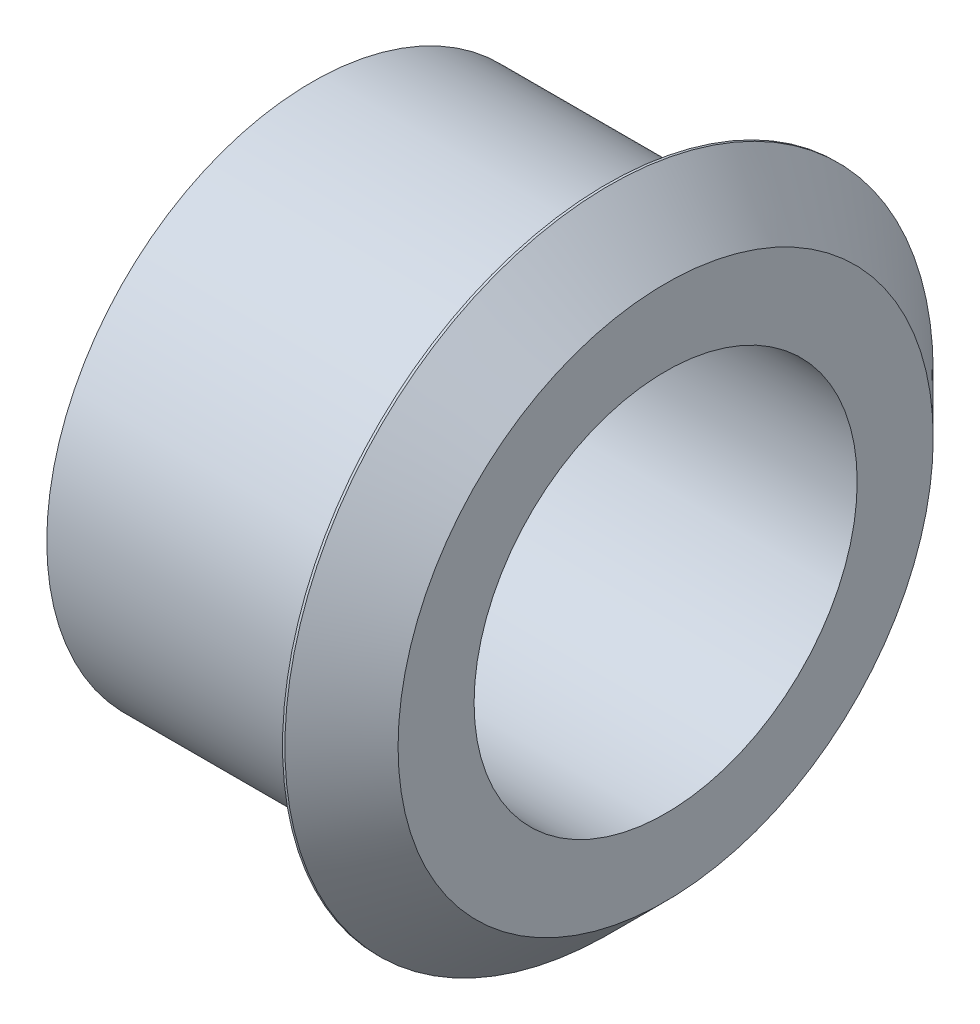
ISO-10303-21;
HEADER;
FILE_DESCRIPTION(('STEP AP214'),'2;1');
FILE_NAME('part.step','',(''),(''),'','','');
FILE_SCHEMA(('AUTOMOTIVE_DESIGN { 1 0 10303 214 1 1 1 1 }'));
ENDSEC;
DATA;
#1=APPLICATION_CONTEXT('core data for automotive mechanical design processes');
#2=APPLICATION_PROTOCOL_DEFINITION('international standard','automotive_design',2000,#1);
#3=PRODUCT_CONTEXT('',#1,'mechanical');
#4=PRODUCT('Part','Part','',(#3));
#5=PRODUCT_RELATED_PRODUCT_CATEGORY('part','',(#4));
#6=PRODUCT_DEFINITION_FORMATION('','',#4);
#7=PRODUCT_DEFINITION_CONTEXT('part definition',#1,'design');
#8=PRODUCT_DEFINITION('design','',#6,#7);
#9=PRODUCT_DEFINITION_SHAPE('','',#8);
#10=(LENGTH_UNIT() NAMED_UNIT(*) SI_UNIT(.MILLI.,.METRE.));
#11=(NAMED_UNIT(*) PLANE_ANGLE_UNIT() SI_UNIT($,.RADIAN.));
#12=(NAMED_UNIT(*) SI_UNIT($,.STERADIAN.) SOLID_ANGLE_UNIT());
#13=UNCERTAINTY_MEASURE_WITH_UNIT(LENGTH_MEASURE(1.E-05),#10,'distance_accuracy_value','');
#14=(GEOMETRIC_REPRESENTATION_CONTEXT(3) GLOBAL_UNCERTAINTY_ASSIGNED_CONTEXT((#13)) GLOBAL_UNIT_ASSIGNED_CONTEXT((#10,
#11,#12)) REPRESENTATION_CONTEXT('',''));
#15=CARTESIAN_POINT('',(0.,0.,0.));
#16=DIRECTION('',(0.,0.,1.));
#17=DIRECTION('',(1.,0.,0.));
#18=AXIS2_PLACEMENT_3D('',#15,#16,#17);
#19=CARTESIAN_POINT('',(3.60680000000002,0.,-225.73742));
#20=DIRECTION('',(1.,0.,0.));
#21=DIRECTION('',(0.,0.,-1.));
#22=AXIS2_PLACEMENT_3D('',#19,#20,#21);
#23=PLANE('',#22);
#24=CARTESIAN_POINT('',(3.60680000000002,0.,-225.73742));
#25=DIRECTION('',(1.,0.,0.));
#26=DIRECTION('',(0.,0.,-1.));
#27=AXIS2_PLACEMENT_3D('',#24,#25,#26);
#28=CIRCLE('',#27,17.4625);
#29=CARTESIAN_POINT('',(3.60680000000002,0.,-243.19992));
#30=VERTEX_POINT('',#29);
#31=EDGE_CURVE('E54',#30,#30,#28,.T.);
#32=ORIENTED_EDGE('',*,*,#31,.F.);
#33=EDGE_LOOP('',(#32));
#34=FACE_BOUND('',#33,.T.);
#35=CARTESIAN_POINT('',(3.60680000000002,0.,-225.73742));
#36=DIRECTION('',(1.,0.,0.));
#37=DIRECTION('',(0.,0.,-1.));
#38=AXIS2_PLACEMENT_3D('',#35,#36,#37);
#39=CIRCLE('',#38,14.2875);
#40=CARTESIAN_POINT('',(3.60680000000001,0.,-240.02492));
#41=VERTEX_POINT('',#40);
#42=EDGE_CURVE('E50',#41,#41,#39,.F.);
#43=ORIENTED_EDGE('',*,*,#42,.F.);
#44=EDGE_LOOP('',(#43));
#45=FACE_BOUND('',#44,.T.);
#46=ADVANCED_FACE('F38',(#34,#45),#23,.F.);
#47=CARTESIAN_POINT('',(6.78180000000001,0.,-225.73742));
#48=DIRECTION('',(1.,0.,0.));
#49=DIRECTION('',(0.,0.,-1.));
#50=AXIS2_PLACEMENT_3D('',#47,#48,#49);
#51=PLANE('',#50);
#52=CARTESIAN_POINT('',(6.78180000000001,0.,-225.73742));
#53=DIRECTION('',(1.,0.,0.));
#54=DIRECTION('',(0.,0.,-1.));
#55=AXIS2_PLACEMENT_3D('',#52,#53,#54);
#56=CIRCLE('',#55,14.4145);
#57=CARTESIAN_POINT('',(6.78180000000001,0.,-240.15192));
#58=VERTEX_POINT('',#57);
#59=EDGE_CURVE('E46',#58,#58,#56,.T.);
#60=ORIENTED_EDGE('',*,*,#59,.T.);
#61=EDGE_LOOP('',(#60));
#62=FACE_BOUND('',#61,.T.);
#63=CARTESIAN_POINT('',(6.78180000000001,0.,-225.73742));
#64=DIRECTION('',(1.,0.,0.));
#65=DIRECTION('',(0.,0.,-1.));
#66=AXIS2_PLACEMENT_3D('',#63,#64,#65);
#67=CIRCLE('',#66,10.31875);
#68=CARTESIAN_POINT('',(6.78180000000001,0.,-236.05617));
#69=VERTEX_POINT('',#68);
#70=EDGE_CURVE('E59',#69,#69,#67,.T.);
#71=ORIENTED_EDGE('',*,*,#70,.F.);
#72=EDGE_LOOP('',(#71));
#73=FACE_BOUND('',#72,.T.);
#74=ADVANCED_FACE('F85',(#62,#73),#51,.T.);
#75=CARTESIAN_POINT('',(6.78180000000001,0.,-225.73742));
#76=DIRECTION('',(-1.,0.,0.));
#77=DIRECTION('',(0.,0.,1.));
#78=AXIS2_PLACEMENT_3D('',#75,#76,#77);
#79=CYLINDRICAL_SURFACE('',#78,17.4625);
#80=CARTESIAN_POINT('',(3.73379999999999,0.,-225.73742));
#81=DIRECTION('',(1.,0.,0.));
#82=DIRECTION('',(0.,0.,-1.));
#83=AXIS2_PLACEMENT_3D('',#80,#81,#82);
#84=CIRCLE('',#83,17.4625);
#85=CARTESIAN_POINT('',(3.73379999999999,0.,-243.19992));
#86=VERTEX_POINT('',#85);
#87=EDGE_CURVE('E10',#86,#86,#84,.F.);
#88=ORIENTED_EDGE('',*,*,#87,.T.);
#89=EDGE_LOOP('',(#88));
#90=FACE_BOUND('',#89,.T.);
#91=ORIENTED_EDGE('',*,*,#31,.T.);
#92=EDGE_LOOP('',(#91));
#93=FACE_BOUND('',#92,.T.);
#94=ADVANCED_FACE('F91',(#90,#93),#79,.T.);
#95=CARTESIAN_POINT('',(6.78180000000001,0.,-225.73742));
#96=DIRECTION('',(-1.,0.,0.));
#97=DIRECTION('',(0.,0.,1.));
#98=AXIS2_PLACEMENT_3D('',#95,#96,#97);
#99=CYLINDRICAL_SURFACE('',#98,10.31875);
#100=ORIENTED_EDGE('',*,*,#70,.T.);
#101=EDGE_LOOP('',(#100));
#102=FACE_BOUND('',#101,.T.);
#103=CARTESIAN_POINT('',(-12.2682,0.,-225.73742));
#104=DIRECTION('',(1.,0.,0.));
#105=DIRECTION('',(0.,0.,-1.));
#106=AXIS2_PLACEMENT_3D('',#103,#104,#105);
#107=CIRCLE('',#106,10.31875);
#108=CARTESIAN_POINT('',(-12.2682,0.,-236.05617));
#109=VERTEX_POINT('',#108);
#110=EDGE_CURVE('E62',#109,#109,#107,.T.);
#111=ORIENTED_EDGE('',*,*,#110,.F.);
#112=EDGE_LOOP('',(#111));
#113=FACE_BOUND('',#112,.T.);
#114=ADVANCED_FACE('F81',(#102,#113),#99,.F.);
#115=CARTESIAN_POINT('',(-52.6793525448111,0.,-225.73742));
#116=DIRECTION('',(1.,0.,0.));
#117=DIRECTION('',(0.,0.,-1.));
#118=AXIS2_PLACEMENT_3D('',#115,#116,#117);
#119=CYLINDRICAL_SURFACE('',#118,14.2875);
#120=CARTESIAN_POINT('',(-12.2682,0.,-225.73742));
#121=DIRECTION('',(1.,0.,0.));
#122=DIRECTION('',(0.,0.,-1.));
#123=AXIS2_PLACEMENT_3D('',#120,#121,#122);
#124=CIRCLE('',#123,14.2875);
#125=CARTESIAN_POINT('',(-12.2682,0.,-240.02492));
#126=VERTEX_POINT('',#125);
#127=EDGE_CURVE('E65',#126,#126,#124,.T.);
#128=CARTESIAN_POINT('',(-12.2682,0.,-240.02492));
#129=CARTESIAN_POINT('',(-12.1028354166667,0.,-240.02492));
#130=CARTESIAN_POINT('',(-11.9374708333333,0.,-240.02492));
#131=CARTESIAN_POINT('',(-11.6067416666667,0.,-240.02492));
#132=CARTESIAN_POINT('',(-11.4413770833333,0.,-240.02492));
#133=CARTESIAN_POINT('',(-11.1106479166667,0.,-240.02492));
#134=CARTESIAN_POINT('',(-10.9452833333333,0.,-240.02492));
#135=CARTESIAN_POINT('',(-10.6145541666667,0.,-240.02492));
#136=CARTESIAN_POINT('',(-10.4491895833333,0.,-240.02492));
#137=CARTESIAN_POINT('',(-10.1184604166667,0.,-240.02492));
#138=CARTESIAN_POINT('',(-9.95309583333332,0.,-240.02492));
#139=CARTESIAN_POINT('',(-9.62236666666665,0.,-240.02492));
#140=CARTESIAN_POINT('',(-9.45700208333332,0.,-240.02492));
#141=CARTESIAN_POINT('',(-9.12627291666665,0.,-240.02492));
#142=CARTESIAN_POINT('',(-8.96090833333332,0.,-240.02492));
#143=CARTESIAN_POINT('',(-8.63017916666665,0.,-240.02492));
#144=CARTESIAN_POINT('',(-8.46481458333332,0.,-240.02492));
#145=CARTESIAN_POINT('',(-8.13408541666665,0.,-240.02492));
#146=CARTESIAN_POINT('',(-7.96872083333332,0.,-240.02492));
#147=CARTESIAN_POINT('',(-7.63799166666665,0.,-240.02492));
#148=CARTESIAN_POINT('',(-7.47262708333332,0.,-240.02492));
#149=CARTESIAN_POINT('',(-7.14189791666665,0.,-240.02492));
#150=CARTESIAN_POINT('',(-6.97653333333332,0.,-240.02492));
#151=CARTESIAN_POINT('',(-6.64580416666665,0.,-240.02492));
#152=CARTESIAN_POINT('',(-6.48043958333332,0.,-240.02492));
#153=CARTESIAN_POINT('',(-6.14971041666665,0.,-240.02492));
#154=CARTESIAN_POINT('',(-5.98434583333332,0.,-240.02492));
#155=CARTESIAN_POINT('',(-5.65361666666665,0.,-240.02492));
#156=CARTESIAN_POINT('',(-5.48825208333332,0.,-240.02492));
#157=CARTESIAN_POINT('',(-5.15752291666665,0.,-240.02492));
#158=CARTESIAN_POINT('',(-4.99215833333332,0.,-240.02492));
#159=CARTESIAN_POINT('',(-4.66142916666665,0.,-240.02492));
#160=CARTESIAN_POINT('',(-4.49606458333332,0.,-240.02492));
#161=CARTESIAN_POINT('',(-4.16533541666665,0.,-240.02492));
#162=CARTESIAN_POINT('',(-3.99997083333332,0.,-240.02492));
#163=CARTESIAN_POINT('',(-3.66924166666666,0.,-240.02492));
#164=CARTESIAN_POINT('',(-3.50387708333332,0.,-240.02492));
#165=CARTESIAN_POINT('',(-3.17314791666665,0.,-240.02492));
#166=CARTESIAN_POINT('',(-3.00778333333332,0.,-240.02492));
#167=CARTESIAN_POINT('',(-2.67705416666665,0.,-240.02492));
#168=CARTESIAN_POINT('',(-2.51168958333332,0.,-240.02492));
#169=CARTESIAN_POINT('',(-2.18096041666666,0.,-240.02492));
#170=CARTESIAN_POINT('',(-2.01559583333332,0.,-240.02492));
#171=CARTESIAN_POINT('',(-1.68486666666665,0.,-240.02492));
#172=CARTESIAN_POINT('',(-1.51950208333332,0.,-240.02492));
#173=CARTESIAN_POINT('',(-1.18877291666665,0.,-240.02492));
#174=CARTESIAN_POINT('',(-1.02340833333332,0.,-240.02492));
#175=CARTESIAN_POINT('',(-0.692679166666654,0.,-240.02492));
#176=CARTESIAN_POINT('',(-0.52731458333332,0.,-240.02492));
#177=CARTESIAN_POINT('',(-0.196585416666652,0.,-240.02492));
#178=CARTESIAN_POINT('',(-0.0312208333333175,0.,-240.02492));
#179=CARTESIAN_POINT('',(0.299508333333349,0.,-240.02492));
#180=CARTESIAN_POINT('',(0.46487291666668,0.,-240.02492));
#181=CARTESIAN_POINT('',(0.795602083333347,0.,-240.02492));
#182=CARTESIAN_POINT('',(0.960966666666681,0.,-240.02492));
#183=CARTESIAN_POINT('',(1.29169583333335,0.,-240.02492));
#184=CARTESIAN_POINT('',(1.45706041666668,0.,-240.02492));
#185=CARTESIAN_POINT('',(1.78778958333335,0.,-240.02492));
#186=CARTESIAN_POINT('',(1.95315416666668,0.,-240.02492));
#187=CARTESIAN_POINT('',(2.28388333333335,0.,-240.02492));
#188=CARTESIAN_POINT('',(2.44924791666668,0.,-240.02492));
#189=CARTESIAN_POINT('',(2.77997708333335,0.,-240.02492));
#190=CARTESIAN_POINT('',(2.94534166666668,0.,-240.02492));
#191=CARTESIAN_POINT('',(3.27607083333335,0.,-240.02492));
#192=CARTESIAN_POINT('',(3.44143541666668,0.,-240.02492));
#193=CARTESIAN_POINT('',(3.60680000000001,0.,-240.02492));
#194=B_SPLINE_CURVE_WITH_KNOTS('',3,(#128,#129,#130,#131,#132,#133,#134,#135,#136,#137,#138,
#139,#140,#141,#142,#143,#144,#145,#146,#147,#148,#149,#150,#151,#152,#153,#154,#155,#156,#157,
#158,#159,#160,#161,#162,#163,#164,#165,#166,#167,#168,#169,#170,#171,#172,#173,#174,#175,#176,
#177,#178,#179,#180,#181,#182,#183,#184,#185,#186,#187,#188,#189,#190,#191,#192,#193),
.UNSPECIFIED.,.F.,.F.,(4,2,2,2,2,2,2,2,2,2,2,2,2,2,2,2,2,2,2,2,2,2,2,2,2,2,2,2,2,2,2,2,4),(0.,
0.496093750000003,0.992187499999998,1.48828125,1.984375,2.48046875,2.9765625,3.47265625,3.96875,
4.46484375,4.9609375,5.45703125,5.953125,6.44921875,6.9453125,7.44140625,7.9375,8.43359375,
8.9296875,9.42578125,9.921875,10.41796875,10.9140625,11.41015625,11.90625,12.40234375,
12.8984375,13.39453125,13.890625,14.38671875,14.8828125,15.37890625,15.875),.UNSPECIFIED.);
#195=EDGE_CURVE('BSEAM69',#126,#41,#194,.T.);
#196=ORIENTED_EDGE('',*,*,#127,.T.);
#197=ORIENTED_EDGE('',*,*,#42,.T.);
#198=ORIENTED_EDGE('',*,*,#195,.T.);
#199=ORIENTED_EDGE('',*,*,#195,.F.);
#200=EDGE_LOOP('',(#196,#198,#197,#199));
#201=FACE_BOUND('',#200,.T.);
#202=ADVANCED_FACE('F69',(#201),#119,.T.);
#203=CARTESIAN_POINT('',(-12.2682,0.,-225.73742));
#204=DIRECTION('',(1.,0.,0.));
#205=DIRECTION('',(0.,0.,-1.));
#206=AXIS2_PLACEMENT_3D('',#203,#204,#205);
#207=PLANE('',#206);
#208=ORIENTED_EDGE('',*,*,#110,.T.);
#209=EDGE_LOOP('',(#208));
#210=FACE_BOUND('',#209,.T.);
#211=ORIENTED_EDGE('',*,*,#127,.F.);
#212=EDGE_LOOP('',(#211));
#213=FACE_BOUND('',#212,.T.);
#214=ADVANCED_FACE('F72',(#210,#213),#207,.F.);
#215=CARTESIAN_POINT('',(6.78180000000001,0.,-225.73742));
#216=DIRECTION('',(-1.,0.,0.));
#217=DIRECTION('',(0.,0.,1.));
#218=AXIS2_PLACEMENT_3D('',#215,#216,#217);
#219=CONICAL_SURFACE('',#218,14.4145,0.78539816339745);
#220=ORIENTED_EDGE('',*,*,#87,.F.);
#221=EDGE_LOOP('',(#220));
#222=FACE_BOUND('',#221,.T.);
#223=ORIENTED_EDGE('',*,*,#59,.F.);
#224=EDGE_LOOP('',(#223));
#225=FACE_BOUND('',#224,.T.);
#226=ADVANCED_FACE('F41',(#222,#225),#219,.T.);
#227=CLOSED_SHELL('',(#46,#74,#94,#114,#202,#214,#226));
#228=MANIFOLD_SOLID_BREP('B2',#227);
#229=ADVANCED_BREP_SHAPE_REPRESENTATION('',(#18,#228),#14);
#230=SHAPE_DEFINITION_REPRESENTATION(#9,#229);
ENDSEC;
END-ISO-10303-21;
